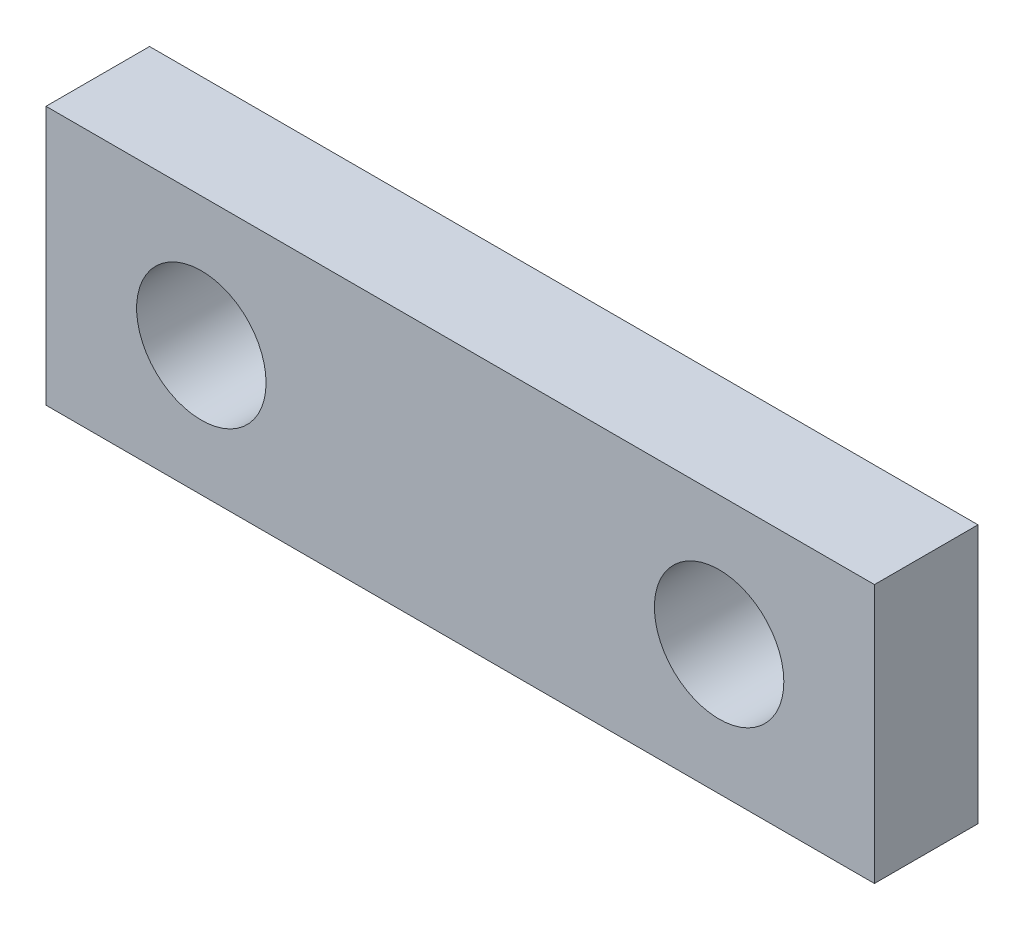
ISO-10303-21;
HEADER;
FILE_DESCRIPTION(('STEP AP214'),'2;1');
FILE_NAME('part.step','',(''),(''),'','','');
FILE_SCHEMA(('AUTOMOTIVE_DESIGN { 1 0 10303 214 1 1 1 1 }'));
ENDSEC;
DATA;
#1=APPLICATION_CONTEXT('core data for automotive mechanical design processes');
#2=APPLICATION_PROTOCOL_DEFINITION('international standard','automotive_design',2000,#1);
#3=PRODUCT_CONTEXT('',#1,'mechanical');
#4=PRODUCT('Part','Part','',(#3));
#5=PRODUCT_RELATED_PRODUCT_CATEGORY('part','',(#4));
#6=PRODUCT_DEFINITION_FORMATION('','',#4);
#7=PRODUCT_DEFINITION_CONTEXT('part definition',#1,'design');
#8=PRODUCT_DEFINITION('design','',#6,#7);
#9=PRODUCT_DEFINITION_SHAPE('','',#8);
#10=(LENGTH_UNIT() NAMED_UNIT(*) SI_UNIT(.MILLI.,.METRE.));
#11=(NAMED_UNIT(*) PLANE_ANGLE_UNIT() SI_UNIT($,.RADIAN.));
#12=(NAMED_UNIT(*) SI_UNIT($,.STERADIAN.) SOLID_ANGLE_UNIT());
#13=UNCERTAINTY_MEASURE_WITH_UNIT(LENGTH_MEASURE(1.E-05),#10,'distance_accuracy_value','');
#14=(GEOMETRIC_REPRESENTATION_CONTEXT(3) GLOBAL_UNCERTAINTY_ASSIGNED_CONTEXT((#13)) GLOBAL_UNIT_ASSIGNED_CONTEXT((#10,
#11,#12)) REPRESENTATION_CONTEXT('',''));
#15=CARTESIAN_POINT('',(0.,0.,0.));
#16=DIRECTION('',(0.,0.,1.));
#17=DIRECTION('',(1.,0.,0.));
#18=AXIS2_PLACEMENT_3D('',#15,#16,#17);
#19=CARTESIAN_POINT('',(0.,0.,2.));
#20=DIRECTION('',(1.,0.,0.));
#21=DIRECTION('',(0.,0.,-1.));
#22=AXIS2_PLACEMENT_3D('',#19,#20,#21);
#23=PLANE('',#22);
#24=DIRECTION('',(0.,-1.,0.));
#25=VECTOR('',#24,1.);
#26=CARTESIAN_POINT('',(0.,0.,0.));
#27=LINE('',#26,#25);
#28=CARTESIAN_POINT('',(0.,5.,0.));
#29=VERTEX_POINT('',#28);
#30=CARTESIAN_POINT('',(0.,0.,0.));
#31=VERTEX_POINT('',#30);
#32=EDGE_CURVE('E119',#29,#31,#27,.T.);
#33=ORIENTED_EDGE('',*,*,#32,.T.);
#34=DIRECTION('',(0.,0.,-1.));
#35=VECTOR('',#34,1.);
#36=CARTESIAN_POINT('',(0.,0.,2.));
#37=LINE('',#36,#35);
#38=CARTESIAN_POINT('',(0.,0.,2.));
#39=VERTEX_POINT('',#38);
#40=EDGE_CURVE('E11',#39,#31,#37,.T.);
#41=ORIENTED_EDGE('',*,*,#40,.F.);
#42=DIRECTION('',(0.,-1.,0.));
#43=VECTOR('',#42,1.);
#44=CARTESIAN_POINT('',(0.,0.,2.));
#45=LINE('',#44,#43);
#46=CARTESIAN_POINT('',(0.,5.,2.));
#47=VERTEX_POINT('',#46);
#48=EDGE_CURVE('E101',#47,#39,#45,.T.);
#49=ORIENTED_EDGE('',*,*,#48,.F.);
#50=DIRECTION('',(0.,0.,-1.));
#51=VECTOR('',#50,1.);
#52=CARTESIAN_POINT('',(0.,5.,2.));
#53=LINE('',#52,#51);
#54=EDGE_CURVE('E115',#47,#29,#53,.T.);
#55=ORIENTED_EDGE('',*,*,#54,.T.);
#56=EDGE_LOOP('',(#33,#41,#49,#55));
#57=FACE_BOUND('',#56,.T.);
#58=ADVANCED_FACE('F49',(#57),#23,.F.);
#59=CARTESIAN_POINT('',(0.,0.,2.));
#60=DIRECTION('',(0.,1.,0.));
#61=DIRECTION('',(0.,0.,1.));
#62=AXIS2_PLACEMENT_3D('',#59,#60,#61);
#63=PLANE('',#62);
#64=DIRECTION('',(1.,0.,0.));
#65=VECTOR('',#64,1.);
#66=CARTESIAN_POINT('',(0.,0.,0.));
#67=LINE('',#66,#65);
#68=CARTESIAN_POINT('',(16.,0.,0.));
#69=VERTEX_POINT('',#68);
#70=EDGE_CURVE('E106',#31,#69,#67,.T.);
#71=ORIENTED_EDGE('',*,*,#70,.T.);
#72=DIRECTION('',(0.,0.,-1.));
#73=VECTOR('',#72,1.);
#74=CARTESIAN_POINT('',(16.,0.,2.));
#75=LINE('',#74,#73);
#76=CARTESIAN_POINT('',(16.,0.,2.));
#77=VERTEX_POINT('',#76);
#78=EDGE_CURVE('E58',#77,#69,#75,.T.);
#79=ORIENTED_EDGE('',*,*,#78,.F.);
#80=DIRECTION('',(1.,0.,0.));
#81=VECTOR('',#80,1.);
#82=CARTESIAN_POINT('',(0.,0.,2.));
#83=LINE('',#82,#81);
#84=EDGE_CURVE('E96',#39,#77,#83,.T.);
#85=ORIENTED_EDGE('',*,*,#84,.F.);
#86=ORIENTED_EDGE('',*,*,#40,.T.);
#87=EDGE_LOOP('',(#71,#79,#85,#86));
#88=FACE_BOUND('',#87,.T.);
#89=ADVANCED_FACE('F105',(#88),#63,.F.);
#90=CARTESIAN_POINT('',(16.,0.,2.));
#91=DIRECTION('',(-1.,0.,0.));
#92=DIRECTION('',(0.,0.,1.));
#93=AXIS2_PLACEMENT_3D('',#90,#91,#92);
#94=PLANE('',#93);
#95=DIRECTION('',(0.,1.,0.));
#96=VECTOR('',#95,1.);
#97=CARTESIAN_POINT('',(16.,0.,0.));
#98=LINE('',#97,#96);
#99=CARTESIAN_POINT('',(16.,5.,0.));
#100=VERTEX_POINT('',#99);
#101=EDGE_CURVE('E83',#69,#100,#98,.T.);
#102=ORIENTED_EDGE('',*,*,#101,.T.);
#103=DIRECTION('',(0.,0.,-1.));
#104=VECTOR('',#103,1.);
#105=CARTESIAN_POINT('',(16.,5.,2.));
#106=LINE('',#105,#104);
#107=CARTESIAN_POINT('',(16.,5.,2.));
#108=VERTEX_POINT('',#107);
#109=EDGE_CURVE('E108',#108,#100,#106,.T.);
#110=ORIENTED_EDGE('',*,*,#109,.F.);
#111=DIRECTION('',(0.,1.,0.));
#112=VECTOR('',#111,1.);
#113=CARTESIAN_POINT('',(16.,0.,2.));
#114=LINE('',#113,#112);
#115=EDGE_CURVE('E99',#77,#108,#114,.T.);
#116=ORIENTED_EDGE('',*,*,#115,.F.);
#117=ORIENTED_EDGE('',*,*,#78,.T.);
#118=EDGE_LOOP('',(#102,#110,#116,#117));
#119=FACE_BOUND('',#118,.T.);
#120=ADVANCED_FACE('F109',(#119),#94,.F.);
#121=CARTESIAN_POINT('',(0.,5.,2.));
#122=DIRECTION('',(0.,-1.,0.));
#123=DIRECTION('',(0.,0.,-1.));
#124=AXIS2_PLACEMENT_3D('',#121,#122,#123);
#125=PLANE('',#124);
#126=DIRECTION('',(-1.,0.,0.));
#127=VECTOR('',#126,1.);
#128=CARTESIAN_POINT('',(0.,5.,0.));
#129=LINE('',#128,#127);
#130=EDGE_CURVE('E89',#100,#29,#129,.T.);
#131=ORIENTED_EDGE('',*,*,#130,.T.);
#132=ORIENTED_EDGE('',*,*,#54,.F.);
#133=DIRECTION('',(-1.,0.,0.));
#134=VECTOR('',#133,1.);
#135=CARTESIAN_POINT('',(0.,5.,2.));
#136=LINE('',#135,#134);
#137=EDGE_CURVE('E66',#108,#47,#136,.T.);
#138=ORIENTED_EDGE('',*,*,#137,.F.);
#139=ORIENTED_EDGE('',*,*,#109,.T.);
#140=EDGE_LOOP('',(#131,#132,#138,#139));
#141=FACE_BOUND('',#140,.T.);
#142=ADVANCED_FACE('F135',(#141),#125,.F.);
#143=CARTESIAN_POINT('',(0.,0.,2.));
#144=DIRECTION('',(0.,0.,-1.));
#145=DIRECTION('',(-1.,0.,0.));
#146=AXIS2_PLACEMENT_3D('',#143,#144,#145);
#147=PLANE('',#146);
#148=CARTESIAN_POINT('',(3.,2.5,2.));
#149=DIRECTION('',(0.,0.,1.));
#150=DIRECTION('',(1.,0.,0.));
#151=AXIS2_PLACEMENT_3D('',#148,#149,#150);
#152=CIRCLE('',#151,1.25);
#153=CARTESIAN_POINT('',(4.25,2.5,2.));
#154=VERTEX_POINT('',#153);
#155=EDGE_CURVE('E155',#154,#154,#152,.T.);
#156=ORIENTED_EDGE('',*,*,#155,.F.);
#157=EDGE_LOOP('',(#156));
#158=FACE_BOUND('',#157,.T.);
#159=CARTESIAN_POINT('',(13.,2.5,2.));
#160=DIRECTION('',(0.,0.,1.));
#161=DIRECTION('',(1.,0.,0.));
#162=AXIS2_PLACEMENT_3D('',#159,#160,#161);
#163=CIRCLE('',#162,1.25);
#164=CARTESIAN_POINT('',(14.25,2.5,2.));
#165=VERTEX_POINT('',#164);
#166=EDGE_CURVE('E147',#165,#165,#163,.T.);
#167=ORIENTED_EDGE('',*,*,#166,.F.);
#168=EDGE_LOOP('',(#167));
#169=FACE_BOUND('',#168,.T.);
#170=ORIENTED_EDGE('',*,*,#48,.T.);
#171=ORIENTED_EDGE('',*,*,#84,.T.);
#172=ORIENTED_EDGE('',*,*,#115,.T.);
#173=ORIENTED_EDGE('',*,*,#137,.T.);
#174=EDGE_LOOP('',(#170,#171,#172,#173));
#175=FACE_BOUND('',#174,.T.);
#176=ADVANCED_FACE('F97',(#158,#169,#175),#147,.F.);
#177=CARTESIAN_POINT('',(0.,0.,0.));
#178=DIRECTION('',(0.,0.,-1.));
#179=DIRECTION('',(-1.,0.,0.));
#180=AXIS2_PLACEMENT_3D('',#177,#178,#179);
#181=PLANE('',#180);
#182=CARTESIAN_POINT('',(3.,2.5,0.));
#183=DIRECTION('',(0.,0.,-1.));
#184=DIRECTION('',(-1.,0.,0.));
#185=AXIS2_PLACEMENT_3D('',#182,#183,#184);
#186=CIRCLE('',#185,1.25);
#187=CARTESIAN_POINT('',(1.75,2.5,0.));
#188=VERTEX_POINT('',#187);
#189=EDGE_CURVE('E151',#188,#188,#186,.T.);
#190=ORIENTED_EDGE('',*,*,#189,.F.);
#191=EDGE_LOOP('',(#190));
#192=FACE_BOUND('',#191,.T.);
#193=CARTESIAN_POINT('',(13.,2.5,0.));
#194=DIRECTION('',(0.,0.,-1.));
#195=DIRECTION('',(-1.,0.,0.));
#196=AXIS2_PLACEMENT_3D('',#193,#194,#195);
#197=CIRCLE('',#196,1.25);
#198=CARTESIAN_POINT('',(11.75,2.5,0.));
#199=VERTEX_POINT('',#198);
#200=EDGE_CURVE('E123',#199,#199,#197,.T.);
#201=ORIENTED_EDGE('',*,*,#200,.F.);
#202=EDGE_LOOP('',(#201));
#203=FACE_BOUND('',#202,.T.);
#204=ORIENTED_EDGE('',*,*,#32,.F.);
#205=ORIENTED_EDGE('',*,*,#130,.F.);
#206=ORIENTED_EDGE('',*,*,#101,.F.);
#207=ORIENTED_EDGE('',*,*,#70,.F.);
#208=EDGE_LOOP('',(#204,#205,#206,#207));
#209=FACE_BOUND('',#208,.T.);
#210=ADVANCED_FACE('F138',(#192,#203,#209),#181,.T.);
#211=CARTESIAN_POINT('',(13.,2.5,2.));
#212=DIRECTION('',(0.,0.,1.));
#213=DIRECTION('',(1.,0.,0.));
#214=AXIS2_PLACEMENT_3D('',#211,#212,#213);
#215=CYLINDRICAL_SURFACE('',#214,1.25);
#216=ORIENTED_EDGE('',*,*,#166,.T.);
#217=EDGE_LOOP('',(#216));
#218=FACE_BOUND('',#217,.T.);
#219=ORIENTED_EDGE('',*,*,#200,.T.);
#220=EDGE_LOOP('',(#219));
#221=FACE_BOUND('',#220,.T.);
#222=ADVANCED_FACE('F170',(#218,#221),#215,.F.);
#223=CARTESIAN_POINT('',(3.,2.5,2.));
#224=DIRECTION('',(0.,0.,1.));
#225=DIRECTION('',(1.,0.,0.));
#226=AXIS2_PLACEMENT_3D('',#223,#224,#225);
#227=CYLINDRICAL_SURFACE('',#226,1.25);
#228=ORIENTED_EDGE('',*,*,#155,.T.);
#229=EDGE_LOOP('',(#228));
#230=FACE_BOUND('',#229,.T.);
#231=ORIENTED_EDGE('',*,*,#189,.T.);
#232=EDGE_LOOP('',(#231));
#233=FACE_BOUND('',#232,.T.);
#234=ADVANCED_FACE('F162',(#230,#233),#227,.F.);
#235=CLOSED_SHELL('',(#58,#89,#120,#142,#176,#210,#222,#234));
#236=MANIFOLD_SOLID_BREP('B2',#235);
#237=ADVANCED_BREP_SHAPE_REPRESENTATION('',(#18,#236),#14);
#238=SHAPE_DEFINITION_REPRESENTATION(#9,#237);
ENDSEC;
END-ISO-10303-21;
